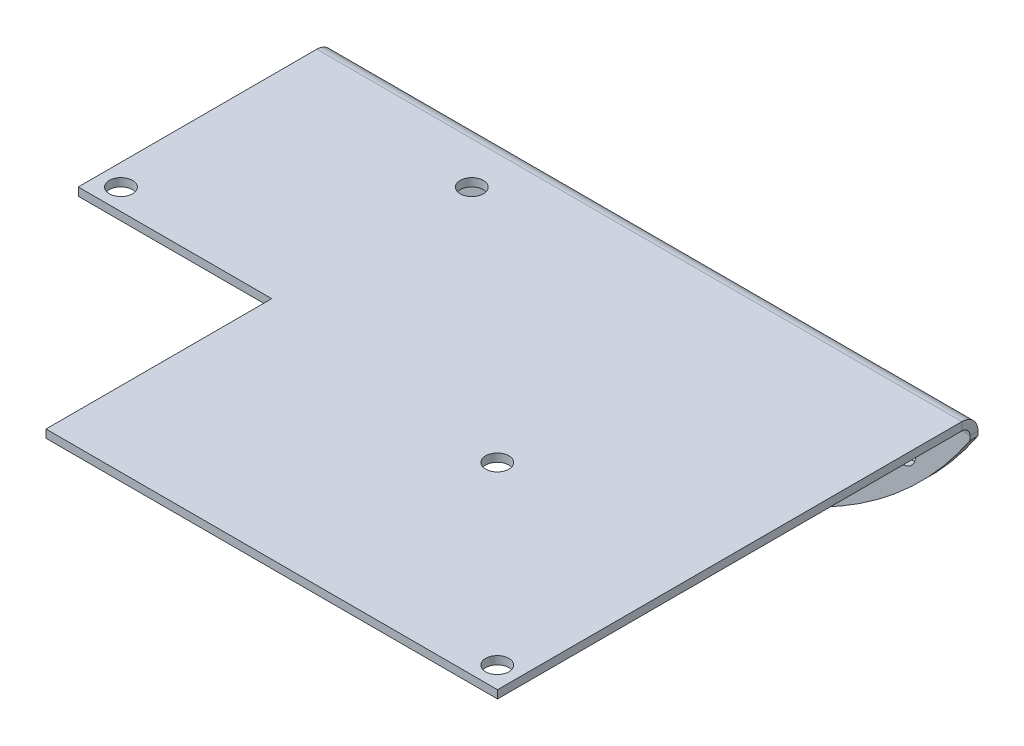
ISO-10303-21;
HEADER;
FILE_DESCRIPTION(('STEP AP214'),'2;1');
FILE_NAME('part.step','',(''),(''),'','','');
FILE_SCHEMA(('AUTOMOTIVE_DESIGN { 1 0 10303 214 1 1 1 1 }'));
ENDSEC;
DATA;
#1=APPLICATION_CONTEXT('core data for automotive mechanical design processes');
#2=APPLICATION_PROTOCOL_DEFINITION('international standard','automotive_design',2000,#1);
#3=PRODUCT_CONTEXT('',#1,'mechanical');
#4=PRODUCT('Part','Part','',(#3));
#5=PRODUCT_RELATED_PRODUCT_CATEGORY('part','',(#4));
#6=PRODUCT_DEFINITION_FORMATION('','',#4);
#7=PRODUCT_DEFINITION_CONTEXT('part definition',#1,'design');
#8=PRODUCT_DEFINITION('design','',#6,#7);
#9=PRODUCT_DEFINITION_SHAPE('','',#8);
#10=(LENGTH_UNIT() NAMED_UNIT(*) SI_UNIT(.MILLI.,.METRE.));
#11=(NAMED_UNIT(*) PLANE_ANGLE_UNIT() SI_UNIT($,.RADIAN.));
#12=(NAMED_UNIT(*) SI_UNIT($,.STERADIAN.) SOLID_ANGLE_UNIT());
#13=UNCERTAINTY_MEASURE_WITH_UNIT(LENGTH_MEASURE(1.E-05),#10,'distance_accuracy_value','');
#14=(GEOMETRIC_REPRESENTATION_CONTEXT(3) GLOBAL_UNCERTAINTY_ASSIGNED_CONTEXT((#13)) GLOBAL_UNIT_ASSIGNED_CONTEXT((#10,
#11,#12)) REPRESENTATION_CONTEXT('',''));
#15=CARTESIAN_POINT('',(0.,0.,0.));
#16=DIRECTION('',(0.,0.,1.));
#17=DIRECTION('',(1.,0.,0.));
#18=AXIS2_PLACEMENT_3D('',#15,#16,#17);
#19=CARTESIAN_POINT('',(0.,-43.9848651624865,41.6620412468196));
#20=DIRECTION('',(0.,-1.,0.));
#21=DIRECTION('',(1.,0.,0.));
#22=AXIS2_PLACEMENT_3D('',#19,#20,#21);
#23=PLANE('',#22);
#24=CARTESIAN_POINT('',(24.7300807192967,-43.9848651624862,56.8325000000002));
#25=DIRECTION('',(0.,1.,0.));
#26=DIRECTION('',(0.,0.,1.));
#27=AXIS2_PLACEMENT_3D('',#24,#25,#26);
#28=CIRCLE('',#27,2.286);
#29=CARTESIAN_POINT('',(24.7300807192967,-43.9848651624862,59.1185000000001));
#30=VERTEX_POINT('',#29);
#31=EDGE_CURVE('E235',#30,#30,#28,.T.);
#32=ORIENTED_EDGE('',*,*,#31,.F.);
#33=EDGE_LOOP('',(#32));
#34=FACE_BOUND('',#33,.T.);
#35=CARTESIAN_POINT('',(59.2740807192967,-43.9848651624861,91.3765000000001));
#36=DIRECTION('',(0.,1.,0.));
#37=DIRECTION('',(0.,0.,1.));
#38=AXIS2_PLACEMENT_3D('',#35,#36,#37);
#39=CIRCLE('',#38,2.28600000000001);
#40=CARTESIAN_POINT('',(59.2740807192967,-43.9848651624861,93.6625000000001));
#41=VERTEX_POINT('',#40);
#42=EDGE_CURVE('E225',#41,#41,#39,.T.);
#43=ORIENTED_EDGE('',*,*,#42,.F.);
#44=EDGE_LOOP('',(#43));
#45=FACE_BOUND('',#44,.T.);
#46=CARTESIAN_POINT('',(-24.7300807192966,-43.9848651624863,12.3825000000001));
#47=DIRECTION('',(0.,1.,0.));
#48=DIRECTION('',(0.,0.,1.));
#49=AXIS2_PLACEMENT_3D('',#46,#47,#48);
#50=CIRCLE('',#49,2.28599999999999);
#51=CARTESIAN_POINT('',(-24.7300807192966,-43.9848651624863,14.6685000000001));
#52=VERTEX_POINT('',#51);
#53=EDGE_CURVE('E222',#52,#52,#50,.T.);
#54=ORIENTED_EDGE('',*,*,#53,.F.);
#55=EDGE_LOOP('',(#54));
#56=FACE_BOUND('',#55,.T.);
#57=CARTESIAN_POINT('',(-59.2740807192966,-43.9848651624862,46.9265000000001));
#58=DIRECTION('',(0.,1.,0.));
#59=DIRECTION('',(0.,0.,1.));
#60=AXIS2_PLACEMENT_3D('',#57,#58,#59);
#61=CIRCLE('',#60,2.28599999999999);
#62=CARTESIAN_POINT('',(-59.2740807192966,-43.9848651624862,49.2125000000001));
#63=VERTEX_POINT('',#62);
#64=EDGE_CURVE('E219',#63,#63,#61,.T.);
#65=ORIENTED_EDGE('',*,*,#64,.F.);
#66=EDGE_LOOP('',(#65));
#67=FACE_BOUND('',#66,.T.);
#68=DIRECTION('',(0.,0.,1.));
#69=VECTOR('',#68,1.);
#70=CARTESIAN_POINT('',(63.5,-43.9848651624865,41.6620412468196));
#71=LINE('',#70,#69);
#72=CARTESIAN_POINT('',(63.5,-43.9848651624864,4.12750000000002));
#73=VERTEX_POINT('',#72);
#74=CARTESIAN_POINT('',(63.5,-43.9848651624867,95.552906409306));
#75=VERTEX_POINT('',#74);
#76=EDGE_CURVE('E57',#73,#75,#71,.T.);
#77=ORIENTED_EDGE('',*,*,#76,.F.);
#78=DIRECTION('',(-1.,0.,0.));
#79=VECTOR('',#78,1.);
#80=CARTESIAN_POINT('',(0.,-43.9848651624864,4.12750000000003));
#81=LINE('',#80,#79);
#82=CARTESIAN_POINT('',(-63.5,-43.9848651624864,4.12750000000002));
#83=VERTEX_POINT('',#82);
#84=EDGE_CURVE('E49',#73,#83,#81,.T.);
#85=ORIENTED_EDGE('',*,*,#84,.T.);
#86=DIRECTION('',(0.,0.,1.));
#87=VECTOR('',#86,1.);
#88=CARTESIAN_POINT('',(-63.5,-43.9848651624865,41.6620412468196));
#89=LINE('',#88,#87);
#90=CARTESIAN_POINT('',(-63.5,-43.9848651624866,51.102906409306));
#91=VERTEX_POINT('',#90);
#92=EDGE_CURVE('E65',#91,#83,#89,.F.);
#93=ORIENTED_EDGE('',*,*,#92,.F.);
#94=DIRECTION('',(1.,0.,0.));
#95=VECTOR('',#94,1.);
#96=CARTESIAN_POINT('',(0.,-43.9848651624866,51.102906409306));
#97=LINE('',#96,#95);
#98=CARTESIAN_POINT('',(-25.4,-43.9848651624866,51.102906409306));
#99=VERTEX_POINT('',#98);
#100=EDGE_CURVE('E189',#99,#91,#97,.F.);
#101=ORIENTED_EDGE('',*,*,#100,.F.);
#102=DIRECTION('',(0.,0.,1.));
#103=VECTOR('',#102,1.);
#104=CARTESIAN_POINT('',(-25.4,-43.9848651624865,41.6620412468196));
#105=LINE('',#104,#103);
#106=CARTESIAN_POINT('',(-25.4,-43.9848651624867,95.552906409306));
#107=VERTEX_POINT('',#106);
#108=EDGE_CURVE('E192',#107,#99,#105,.F.);
#109=ORIENTED_EDGE('',*,*,#108,.F.);
#110=DIRECTION('',(1.,0.,0.));
#111=VECTOR('',#110,1.);
#112=CARTESIAN_POINT('',(0.,-43.9848651624867,95.552906409306));
#113=LINE('',#112,#111);
#114=EDGE_CURVE('E155',#75,#107,#113,.F.);
#115=ORIENTED_EDGE('',*,*,#114,.F.);
#116=EDGE_LOOP('',(#77,#85,#93,#101,#109,#115));
#117=FACE_BOUND('',#116,.T.);
#118=ADVANCED_FACE('F40',(#34,#45,#56,#67,#117),#23,.F.);
#119=CARTESIAN_POINT('',(-25.4,-45.5723651624867,95.552906409306));
#120=DIRECTION('',(-1.,0.,0.));
#121=DIRECTION('',(0.,0.,-1.));
#122=AXIS2_PLACEMENT_3D('',#119,#120,#121);
#123=PLANE('',#122);
#124=DIRECTION('',(0.,-1.,0.));
#125=VECTOR('',#124,1.);
#126=CARTESIAN_POINT('',(-25.4,-45.5723651624867,95.552906409306));
#127=LINE('',#126,#125);
#128=CARTESIAN_POINT('',(-25.4,-45.5723651624867,95.552906409306));
#129=VERTEX_POINT('',#128);
#130=EDGE_CURVE('E202',#107,#129,#127,.T.);
#131=ORIENTED_EDGE('',*,*,#130,.F.);
#132=ORIENTED_EDGE('',*,*,#108,.T.);
#133=DIRECTION('',(0.,-1.,0.));
#134=VECTOR('',#133,1.);
#135=CARTESIAN_POINT('',(-25.4,-45.5723651624866,51.102906409306));
#136=LINE('',#135,#134);
#137=CARTESIAN_POINT('',(-25.4,-45.5723651624866,51.102906409306));
#138=VERTEX_POINT('',#137);
#139=EDGE_CURVE('E199',#99,#138,#136,.T.);
#140=ORIENTED_EDGE('',*,*,#139,.T.);
#141=DIRECTION('',(0.,0.,-1.));
#142=VECTOR('',#141,1.);
#143=CARTESIAN_POINT('',(-25.4,-45.5723651624867,95.552906409306));
#144=LINE('',#143,#142);
#145=EDGE_CURVE('E181',#129,#138,#144,.T.);
#146=ORIENTED_EDGE('',*,*,#145,.F.);
#147=EDGE_LOOP('',(#131,#132,#140,#146));
#148=FACE_BOUND('',#147,.T.);
#149=ADVANCED_FACE('F261',(#148),#123,.T.);
#150=CARTESIAN_POINT('',(-63.5,-45.5723651624866,51.102906409306));
#151=DIRECTION('',(0.,0.,1.));
#152=DIRECTION('',(-1.,0.,0.));
#153=AXIS2_PLACEMENT_3D('',#150,#151,#152);
#154=PLANE('',#153);
#155=ORIENTED_EDGE('',*,*,#139,.F.);
#156=ORIENTED_EDGE('',*,*,#100,.T.);
#157=DIRECTION('',(0.,-1.,0.));
#158=VECTOR('',#157,1.);
#159=CARTESIAN_POINT('',(-63.5,-45.5723651624866,51.102906409306));
#160=LINE('',#159,#158);
#161=CARTESIAN_POINT('',(-63.5,-45.5723651624866,51.102906409306));
#162=VERTEX_POINT('',#161);
#163=EDGE_CURVE('E197',#91,#162,#160,.T.);
#164=ORIENTED_EDGE('',*,*,#163,.T.);
#165=DIRECTION('',(-1.,0.,0.));
#166=VECTOR('',#165,1.);
#167=CARTESIAN_POINT('',(-63.5,-45.5723651624866,51.102906409306));
#168=LINE('',#167,#166);
#169=EDGE_CURVE('E185',#138,#162,#168,.T.);
#170=ORIENTED_EDGE('',*,*,#169,.F.);
#171=EDGE_LOOP('',(#155,#156,#164,#170));
#172=FACE_BOUND('',#171,.T.);
#173=ADVANCED_FACE('F258',(#172),#154,.T.);
#174=CARTESIAN_POINT('',(-63.5,-45.5723651624865,38.402906409306));
#175=DIRECTION('',(-1.,0.,0.));
#176=DIRECTION('',(0.,0.,-1.));
#177=AXIS2_PLACEMENT_3D('',#174,#175,#176);
#178=PLANE('',#177);
#179=DIRECTION('',(0.,1.,0.));
#180=VECTOR('',#179,1.);
#181=CARTESIAN_POINT('',(-63.5,-45.5723651624862,4.12750000000001));
#182=LINE('',#181,#180);
#183=CARTESIAN_POINT('',(-63.5,-45.5723651624864,4.1275));
#184=VERTEX_POINT('',#183);
#185=EDGE_CURVE('E208',#184,#83,#182,.T.);
#186=ORIENTED_EDGE('',*,*,#185,.F.);
#187=DIRECTION('',(0.,0.,-1.));
#188=VECTOR('',#187,1.);
#189=CARTESIAN_POINT('',(-63.5,-45.5723651624865,38.402906409306));
#190=LINE('',#189,#188);
#191=EDGE_CURVE('E188',#162,#184,#190,.T.);
#192=ORIENTED_EDGE('',*,*,#191,.F.);
#193=ORIENTED_EDGE('',*,*,#163,.F.);
#194=ORIENTED_EDGE('',*,*,#92,.T.);
#195=EDGE_LOOP('',(#186,#192,#193,#194));
#196=FACE_BOUND('',#195,.T.);
#197=ADVANCED_FACE('F251',(#196),#178,.T.);
#198=CARTESIAN_POINT('',(63.5,-45.5723651624865,38.402906409306));
#199=DIRECTION('',(1.,0.,0.));
#200=DIRECTION('',(0.,0.,1.));
#201=AXIS2_PLACEMENT_3D('',#198,#199,#200);
#202=PLANE('',#201);
#203=DIRECTION('',(0.,-1.,0.));
#204=VECTOR('',#203,1.);
#205=CARTESIAN_POINT('',(63.5,-45.5723651624862,4.12750000000001));
#206=LINE('',#205,#204);
#207=CARTESIAN_POINT('',(63.5,-45.5723651624864,4.12750000000001));
#208=VERTEX_POINT('',#207);
#209=EDGE_CURVE('E12',#73,#208,#206,.T.);
#210=ORIENTED_EDGE('',*,*,#209,.F.);
#211=ORIENTED_EDGE('',*,*,#76,.T.);
#212=DIRECTION('',(0.,-1.,0.));
#213=VECTOR('',#212,1.);
#214=CARTESIAN_POINT('',(63.5,-45.5723651624867,95.552906409306));
#215=LINE('',#214,#213);
#216=CARTESIAN_POINT('',(63.5,-45.5723651624867,95.552906409306));
#217=VERTEX_POINT('',#216);
#218=EDGE_CURVE('E200',#75,#217,#215,.T.);
#219=ORIENTED_EDGE('',*,*,#218,.T.);
#220=DIRECTION('',(0.,0.,1.));
#221=VECTOR('',#220,1.);
#222=CARTESIAN_POINT('',(63.5,-45.5723651624865,38.402906409306));
#223=LINE('',#222,#221);
#224=EDGE_CURVE('E182',#208,#217,#223,.T.);
#225=ORIENTED_EDGE('',*,*,#224,.F.);
#226=EDGE_LOOP('',(#210,#211,#219,#225));
#227=FACE_BOUND('',#226,.T.);
#228=ADVANCED_FACE('F42',(#227),#202,.T.);
#229=CARTESIAN_POINT('',(-25.4,-45.5723651624867,95.552906409306));
#230=DIRECTION('',(0.,0.,1.));
#231=DIRECTION('',(-1.,0.,0.));
#232=AXIS2_PLACEMENT_3D('',#229,#230,#231);
#233=PLANE('',#232);
#234=ORIENTED_EDGE('',*,*,#114,.T.);
#235=ORIENTED_EDGE('',*,*,#130,.T.);
#236=DIRECTION('',(-1.,0.,0.));
#237=VECTOR('',#236,1.);
#238=CARTESIAN_POINT('',(-25.4,-45.5723651624867,95.552906409306));
#239=LINE('',#238,#237);
#240=EDGE_CURVE('E178',#217,#129,#239,.T.);
#241=ORIENTED_EDGE('',*,*,#240,.F.);
#242=ORIENTED_EDGE('',*,*,#218,.F.);
#243=EDGE_LOOP('',(#234,#235,#241,#242));
#244=FACE_BOUND('',#243,.T.);
#245=ADVANCED_FACE('F264',(#244),#233,.T.);
#246=CARTESIAN_POINT('',(0.,-45.5723651624865,41.6620412468196));
#247=DIRECTION('',(0.,-1.,0.));
#248=DIRECTION('',(1.,0.,0.));
#249=AXIS2_PLACEMENT_3D('',#246,#247,#248);
#250=PLANE('',#249);
#251=CARTESIAN_POINT('',(24.7300807192967,-45.5723651624866,56.8325000000002));
#252=DIRECTION('',(0.,-1.,0.));
#253=DIRECTION('',(0.,0.,-1.));
#254=AXIS2_PLACEMENT_3D('',#251,#252,#253);
#255=CIRCLE('',#254,2.286);
#256=CARTESIAN_POINT('',(24.7300807192967,-45.5723651624866,54.5465000000002));
#257=VERTEX_POINT('',#256);
#258=EDGE_CURVE('E44',#257,#257,#255,.T.);
#259=ORIENTED_EDGE('',*,*,#258,.F.);
#260=EDGE_LOOP('',(#259));
#261=FACE_BOUND('',#260,.T.);
#262=CARTESIAN_POINT('',(59.2740807192967,-45.5723651624867,91.3765000000001));
#263=DIRECTION('',(0.,-1.,0.));
#264=DIRECTION('',(0.,0.,-1.));
#265=AXIS2_PLACEMENT_3D('',#262,#263,#264);
#266=CIRCLE('',#265,2.28600000000001);
#267=CARTESIAN_POINT('',(59.2740807192967,-45.5723651624867,89.0905000000001));
#268=VERTEX_POINT('',#267);
#269=EDGE_CURVE('E223',#268,#268,#266,.T.);
#270=ORIENTED_EDGE('',*,*,#269,.F.);
#271=EDGE_LOOP('',(#270));
#272=FACE_BOUND('',#271,.T.);
#273=CARTESIAN_POINT('',(-24.7300807192966,-45.5723651624864,12.3825000000001));
#274=DIRECTION('',(0.,-1.,0.));
#275=DIRECTION('',(0.,0.,-1.));
#276=AXIS2_PLACEMENT_3D('',#273,#274,#275);
#277=CIRCLE('',#276,2.28599999999999);
#278=CARTESIAN_POINT('',(-24.7300807192966,-45.5723651624864,10.0965000000001));
#279=VERTEX_POINT('',#278);
#280=EDGE_CURVE('E220',#279,#279,#277,.T.);
#281=ORIENTED_EDGE('',*,*,#280,.F.);
#282=EDGE_LOOP('',(#281));
#283=FACE_BOUND('',#282,.T.);
#284=CARTESIAN_POINT('',(-59.2740807192966,-45.5723651624865,46.9265000000001));
#285=DIRECTION('',(0.,-1.,0.));
#286=DIRECTION('',(0.,0.,-1.));
#287=AXIS2_PLACEMENT_3D('',#284,#285,#286);
#288=CIRCLE('',#287,2.28599999999999);
#289=CARTESIAN_POINT('',(-59.2740807192966,-45.5723651624865,44.6405000000001));
#290=VERTEX_POINT('',#289);
#291=EDGE_CURVE('E216',#290,#290,#288,.T.);
#292=ORIENTED_EDGE('',*,*,#291,.F.);
#293=EDGE_LOOP('',(#292));
#294=FACE_BOUND('',#293,.T.);
#295=DIRECTION('',(-1.,0.,0.));
#296=VECTOR('',#295,1.);
#297=CARTESIAN_POINT('',(0.,-45.5723651624864,4.12750000000001));
#298=LINE('',#297,#296);
#299=EDGE_CURVE('E204',#208,#184,#298,.T.);
#300=ORIENTED_EDGE('',*,*,#299,.F.);
#301=ORIENTED_EDGE('',*,*,#224,.T.);
#302=ORIENTED_EDGE('',*,*,#240,.T.);
#303=ORIENTED_EDGE('',*,*,#145,.T.);
#304=ORIENTED_EDGE('',*,*,#169,.T.);
#305=ORIENTED_EDGE('',*,*,#191,.T.);
#306=EDGE_LOOP('',(#300,#301,#302,#303,#304,#305));
#307=FACE_BOUND('',#306,.T.);
#308=ADVANCED_FACE('F253',(#261,#272,#283,#294,#307),#250,.T.);
#309=CARTESIAN_POINT('',(0.,-5.8848651624864,2.54));
#310=DIRECTION('',(0.,0.,1.));
#311=DIRECTION('',(1.,0.,0.));
#312=AXIS2_PLACEMENT_3D('',#309,#310,#311);
#313=CYLINDRICAL_SURFACE('',#312,76.2);
#314=DIRECTION('',(0.,0.,1.));
#315=VECTOR('',#314,1.);
#316=CARTESIAN_POINT('',(-63.5,-48.006,2.54));
#317=LINE('',#316,#315);
#318=CARTESIAN_POINT('',(-63.5,-48.006,0.9525));
#319=VERTEX_POINT('',#318);
#320=CARTESIAN_POINT('',(-63.5,-48.006,2.54));
#321=VERTEX_POINT('',#320);
#322=EDGE_CURVE('E157',#319,#321,#317,.T.);
#323=ORIENTED_EDGE('',*,*,#322,.F.);
#324=CARTESIAN_POINT('',(0.,-5.8848651624864,0.9525));
#325=DIRECTION('',(0.,0.,1.));
#326=DIRECTION('',(1.,0.,0.));
#327=AXIS2_PLACEMENT_3D('',#324,#325,#326);
#328=CIRCLE('',#327,76.2);
#329=CARTESIAN_POINT('',(63.5,-48.006,0.9525));
#330=VERTEX_POINT('',#329);
#331=EDGE_CURVE('E173',#319,#330,#328,.T.);
#332=ORIENTED_EDGE('',*,*,#331,.T.);
#333=DIRECTION('',(0.,0.,1.));
#334=VECTOR('',#333,1.);
#335=CARTESIAN_POINT('',(63.5,-48.006,2.54));
#336=LINE('',#335,#334);
#337=CARTESIAN_POINT('',(63.5,-48.006,2.54));
#338=VERTEX_POINT('',#337);
#339=EDGE_CURVE('E147',#330,#338,#336,.T.);
#340=ORIENTED_EDGE('',*,*,#339,.T.);
#341=CARTESIAN_POINT('',(0.,-5.8848651624864,2.54));
#342=DIRECTION('',(0.,0.,1.));
#343=DIRECTION('',(1.,0.,0.));
#344=AXIS2_PLACEMENT_3D('',#341,#342,#343);
#345=CIRCLE('',#344,76.2);
#346=EDGE_CURVE('E145',#321,#338,#345,.T.);
#347=ORIENTED_EDGE('',*,*,#346,.F.);
#348=EDGE_LOOP('',(#323,#332,#340,#347));
#349=FACE_BOUND('',#348,.T.);
#350=ADVANCED_FACE('F284',(#349),#313,.T.);
#351=CARTESIAN_POINT('',(0.,-5.8848651624864,2.54));
#352=DIRECTION('',(0.,0.,1.));
#353=DIRECTION('',(1.,0.,0.));
#354=AXIS2_PLACEMENT_3D('',#351,#352,#353);
#355=PLANE('',#354);
#356=CARTESIAN_POINT('',(50.2894342779869,-56.1742994404739,2.54));
#357=DIRECTION('',(0.,0.,1.));
#358=DIRECTION('',(1.,0.,0.));
#359=AXIS2_PLACEMENT_3D('',#356,#357,#358);
#360=CIRCLE('',#359,2.48919999999999);
#361=CARTESIAN_POINT('',(52.7786342779869,-56.1742994404739,2.54));
#362=VERTEX_POINT('',#361);
#363=EDGE_CURVE('E344',#362,#362,#360,.T.);
#364=ORIENTED_EDGE('',*,*,#363,.F.);
#365=EDGE_LOOP('',(#364));
#366=FACE_BOUND('',#365,.T.);
#367=CARTESIAN_POINT('',(0.,-77.0048651624864,2.54));
#368=DIRECTION('',(0.,0.,1.));
#369=DIRECTION('',(1.,0.,0.));
#370=AXIS2_PLACEMENT_3D('',#367,#368,#369);
#371=CIRCLE('',#370,2.48919999999999);
#372=CARTESIAN_POINT('',(2.48919999999996,-77.0048651624864,2.54));
#373=VERTEX_POINT('',#372);
#374=EDGE_CURVE('E354',#373,#373,#371,.T.);
#375=ORIENTED_EDGE('',*,*,#374,.F.);
#376=EDGE_LOOP('',(#375));
#377=FACE_BOUND('',#376,.T.);
#378=CARTESIAN_POINT('',(-50.2894342779874,-56.1742994404735,2.54));
#379=DIRECTION('',(0.,0.,1.));
#380=DIRECTION('',(1.,0.,0.));
#381=AXIS2_PLACEMENT_3D('',#378,#379,#380);
#382=CIRCLE('',#381,2.48919999999999);
#383=CARTESIAN_POINT('',(-47.8002342779874,-56.1742994404735,2.54));
#384=VERTEX_POINT('',#383);
#385=EDGE_CURVE('E359',#384,#384,#382,.T.);
#386=ORIENTED_EDGE('',*,*,#385,.F.);
#387=EDGE_LOOP('',(#386));
#388=FACE_BOUND('',#387,.T.);
#389=DIRECTION('',(0.,1.,0.));
#390=VECTOR('',#389,1.);
#391=CARTESIAN_POINT('',(63.5,-9.14400000000001,2.54));
#392=LINE('',#391,#390);
#393=CARTESIAN_POINT('',(63.5,-47.1598651624864,2.54));
#394=VERTEX_POINT('',#393);
#395=EDGE_CURVE('E139',#338,#394,#392,.T.);
#396=ORIENTED_EDGE('',*,*,#395,.T.);
#397=DIRECTION('',(-1.,0.,0.));
#398=VECTOR('',#397,1.);
#399=CARTESIAN_POINT('',(0.,-47.1598651624864,2.54));
#400=LINE('',#399,#398);
#401=CARTESIAN_POINT('',(-63.5,-47.1598651624864,2.54));
#402=VERTEX_POINT('',#401);
#403=EDGE_CURVE('E132',#394,#402,#400,.T.);
#404=ORIENTED_EDGE('',*,*,#403,.T.);
#405=DIRECTION('',(0.,-1.,0.));
#406=VECTOR('',#405,1.);
#407=CARTESIAN_POINT('',(-63.5,-9.14400000000001,2.54));
#408=LINE('',#407,#406);
#409=EDGE_CURVE('E138',#402,#321,#408,.T.);
#410=ORIENTED_EDGE('',*,*,#409,.T.);
#411=ORIENTED_EDGE('',*,*,#346,.T.);
#412=EDGE_LOOP('',(#396,#404,#410,#411));
#413=FACE_BOUND('',#412,.T.);
#414=ADVANCED_FACE('F143',(#366,#377,#388,#413),#355,.T.);
#415=CARTESIAN_POINT('',(-63.5,-9.14400000000001,2.54));
#416=DIRECTION('',(-1.,0.,0.));
#417=DIRECTION('',(0.,-1.,0.));
#418=AXIS2_PLACEMENT_3D('',#415,#416,#417);
#419=PLANE('',#418);
#420=ORIENTED_EDGE('',*,*,#409,.F.);
#421=DIRECTION('',(0.,0.,-1.));
#422=VECTOR('',#421,1.);
#423=CARTESIAN_POINT('',(-63.5,-47.1598651624864,2.53999999999973));
#424=LINE('',#423,#422);
#425=CARTESIAN_POINT('',(-63.5,-47.1598651624864,0.9525));
#426=VERTEX_POINT('',#425);
#427=EDGE_CURVE('E167',#402,#426,#424,.T.);
#428=ORIENTED_EDGE('',*,*,#427,.T.);
#429=DIRECTION('',(0.,1.,0.));
#430=VECTOR('',#429,1.);
#431=CARTESIAN_POINT('',(-63.5,-5.8848651624864,0.9525));
#432=LINE('',#431,#430);
#433=EDGE_CURVE('E165',#426,#319,#432,.F.);
#434=ORIENTED_EDGE('',*,*,#433,.T.);
#435=ORIENTED_EDGE('',*,*,#322,.T.);
#436=EDGE_LOOP('',(#420,#428,#434,#435));
#437=FACE_BOUND('',#436,.T.);
#438=ADVANCED_FACE('F294',(#437),#419,.T.);
#439=CARTESIAN_POINT('',(0.,-5.8848651624864,0.9525));
#440=DIRECTION('',(0.,0.,1.));
#441=DIRECTION('',(1.,0.,0.));
#442=AXIS2_PLACEMENT_3D('',#439,#440,#441);
#443=PLANE('',#442);
#444=CARTESIAN_POINT('',(50.2894342779869,-56.1742994404739,0.952499999999999));
#445=DIRECTION('',(0.,0.,-1.));
#446=DIRECTION('',(-1.,0.,0.));
#447=AXIS2_PLACEMENT_3D('',#444,#445,#446);
#448=CIRCLE('',#447,2.48919999999999);
#449=CARTESIAN_POINT('',(47.800234277987,-56.1742994404739,0.952499999999999));
#450=VERTEX_POINT('',#449);
#451=EDGE_CURVE('E347',#450,#450,#448,.T.);
#452=ORIENTED_EDGE('',*,*,#451,.F.);
#453=EDGE_LOOP('',(#452));
#454=FACE_BOUND('',#453,.T.);
#455=CARTESIAN_POINT('',(0.,-77.0048651624864,0.952499999999999));
#456=DIRECTION('',(0.,0.,-1.));
#457=DIRECTION('',(-1.,0.,0.));
#458=AXIS2_PLACEMENT_3D('',#455,#456,#457);
#459=CIRCLE('',#458,2.48919999999999);
#460=CARTESIAN_POINT('',(-2.48920000000001,-77.0048651624864,0.952499999999999));
#461=VERTEX_POINT('',#460);
#462=EDGE_CURVE('E349',#461,#461,#459,.T.);
#463=ORIENTED_EDGE('',*,*,#462,.F.);
#464=EDGE_LOOP('',(#463));
#465=FACE_BOUND('',#464,.T.);
#466=CARTESIAN_POINT('',(-50.2894342779874,-56.1742994404735,0.952499999999999));
#467=DIRECTION('',(0.,0.,-1.));
#468=DIRECTION('',(-1.,0.,0.));
#469=AXIS2_PLACEMENT_3D('',#466,#467,#468);
#470=CIRCLE('',#469,2.48919999999999);
#471=CARTESIAN_POINT('',(-52.7786342779874,-56.1742994404735,0.952499999999999));
#472=VERTEX_POINT('',#471);
#473=EDGE_CURVE('E357',#472,#472,#470,.T.);
#474=ORIENTED_EDGE('',*,*,#473,.F.);
#475=EDGE_LOOP('',(#474));
#476=FACE_BOUND('',#475,.T.);
#477=DIRECTION('',(-1.,0.,0.));
#478=VECTOR('',#477,1.);
#479=CARTESIAN_POINT('',(0.,-47.1598651624864,0.9525));
#480=LINE('',#479,#478);
#481=CARTESIAN_POINT('',(63.5,-47.1598651624864,0.9525));
#482=VERTEX_POINT('',#481);
#483=EDGE_CURVE('E176',#482,#426,#480,.T.);
#484=ORIENTED_EDGE('',*,*,#483,.F.);
#485=DIRECTION('',(0.,1.,0.));
#486=VECTOR('',#485,1.);
#487=CARTESIAN_POINT('',(63.5,-5.8848651624864,0.9525));
#488=LINE('',#487,#486);
#489=EDGE_CURVE('E152',#330,#482,#488,.T.);
#490=ORIENTED_EDGE('',*,*,#489,.F.);
#491=ORIENTED_EDGE('',*,*,#331,.F.);
#492=ORIENTED_EDGE('',*,*,#433,.F.);
#493=EDGE_LOOP('',(#484,#490,#491,#492));
#494=FACE_BOUND('',#493,.T.);
#495=ADVANCED_FACE('F291',(#454,#465,#476,#494),#443,.F.);
#496=CARTESIAN_POINT('',(63.5,-9.14400000000001,2.54));
#497=DIRECTION('',(1.,0.,0.));
#498=DIRECTION('',(0.,1.,0.));
#499=AXIS2_PLACEMENT_3D('',#496,#497,#498);
#500=PLANE('',#499);
#501=ORIENTED_EDGE('',*,*,#489,.T.);
#502=DIRECTION('',(0.,0.,1.));
#503=VECTOR('',#502,1.);
#504=CARTESIAN_POINT('',(63.5,-47.1598651624864,2.53999999999973));
#505=LINE('',#504,#503);
#506=EDGE_CURVE('E123',#482,#394,#505,.T.);
#507=ORIENTED_EDGE('',*,*,#506,.T.);
#508=ORIENTED_EDGE('',*,*,#395,.F.);
#509=ORIENTED_EDGE('',*,*,#339,.F.);
#510=EDGE_LOOP('',(#501,#507,#508,#509));
#511=FACE_BOUND('',#510,.T.);
#512=ADVANCED_FACE('F150',(#511),#500,.T.);
#513=CARTESIAN_POINT('',(63.5,-47.1598651624864,4.1275));
#514=DIRECTION('',(-1.,0.,0.));
#515=DIRECTION('',(0.,0.,1.));
#516=AXIS2_PLACEMENT_3D('',#513,#514,#515);
#517=PLANE('',#516);
#518=ORIENTED_EDGE('',*,*,#506,.F.);
#519=CARTESIAN_POINT('',(63.5,-47.1598651624864,4.1275));
#520=DIRECTION('',(-1.,0.,0.));
#521=DIRECTION('',(0.,0.,1.));
#522=AXIS2_PLACEMENT_3D('',#519,#520,#521);
#523=CIRCLE('',#522,3.175);
#524=EDGE_CURVE('E160',#482,#73,#523,.F.);
#525=ORIENTED_EDGE('',*,*,#524,.T.);
#526=ORIENTED_EDGE('',*,*,#209,.T.);
#527=CARTESIAN_POINT('',(63.5,-47.1598651624864,4.1275));
#528=DIRECTION('',(1.,0.,0.));
#529=DIRECTION('',(0.,0.,-1.));
#530=AXIS2_PLACEMENT_3D('',#527,#528,#529);
#531=CIRCLE('',#530,1.5875);
#532=EDGE_CURVE('E118',#394,#208,#531,.T.);
#533=ORIENTED_EDGE('',*,*,#532,.F.);
#534=EDGE_LOOP('',(#518,#525,#526,#533));
#535=FACE_BOUND('',#534,.T.);
#536=ADVANCED_FACE('F120',(#535),#517,.F.);
#537=CARTESIAN_POINT('',(-63.5,-47.1598651624864,4.1275));
#538=DIRECTION('',(1.,0.,0.));
#539=DIRECTION('',(0.,0.,-1.));
#540=AXIS2_PLACEMENT_3D('',#537,#538,#539);
#541=PLANE('',#540);
#542=ORIENTED_EDGE('',*,*,#185,.T.);
#543=CARTESIAN_POINT('',(-63.5,-47.1598651624864,4.1275));
#544=DIRECTION('',(-1.,0.,0.));
#545=DIRECTION('',(0.,0.,1.));
#546=AXIS2_PLACEMENT_3D('',#543,#544,#545);
#547=CIRCLE('',#546,3.175);
#548=EDGE_CURVE('E128',#83,#426,#547,.T.);
#549=ORIENTED_EDGE('',*,*,#548,.T.);
#550=ORIENTED_EDGE('',*,*,#427,.F.);
#551=CARTESIAN_POINT('',(-63.5,-47.1598651624864,4.1275));
#552=DIRECTION('',(-1.,0.,0.));
#553=DIRECTION('',(0.,0.,1.));
#554=AXIS2_PLACEMENT_3D('',#551,#552,#553);
#555=CIRCLE('',#554,1.5875);
#556=EDGE_CURVE('E127',#184,#402,#555,.T.);
#557=ORIENTED_EDGE('',*,*,#556,.F.);
#558=EDGE_LOOP('',(#542,#549,#550,#557));
#559=FACE_BOUND('',#558,.T.);
#560=ADVANCED_FACE('F249',(#559),#541,.F.);
#561=CARTESIAN_POINT('',(127.064988049164,-47.1598651624864,4.1275));
#562=DIRECTION('',(-1.,0.,0.));
#563=DIRECTION('',(0.,0.,1.));
#564=AXIS2_PLACEMENT_3D('',#561,#562,#563);
#565=CYLINDRICAL_SURFACE('',#564,1.5875);
#566=ORIENTED_EDGE('',*,*,#556,.T.);
#567=ORIENTED_EDGE('',*,*,#403,.F.);
#568=ORIENTED_EDGE('',*,*,#532,.T.);
#569=ORIENTED_EDGE('',*,*,#299,.T.);
#570=EDGE_LOOP('',(#566,#567,#568,#569));
#571=FACE_BOUND('',#570,.T.);
#572=ADVANCED_FACE('F134',(#571),#565,.F.);
#573=CARTESIAN_POINT('',(127.064988049164,-47.1598651624864,4.1275));
#574=DIRECTION('',(-1.,0.,0.));
#575=DIRECTION('',(0.,0.,1.));
#576=AXIS2_PLACEMENT_3D('',#573,#574,#575);
#577=CYLINDRICAL_SURFACE('',#576,3.175);
#578=ORIENTED_EDGE('',*,*,#548,.F.);
#579=ORIENTED_EDGE('',*,*,#84,.F.);
#580=ORIENTED_EDGE('',*,*,#524,.F.);
#581=ORIENTED_EDGE('',*,*,#483,.T.);
#582=EDGE_LOOP('',(#578,#579,#580,#581));
#583=FACE_BOUND('',#582,.T.);
#584=ADVANCED_FACE('F247',(#583),#577,.T.);
#585=CARTESIAN_POINT('',(-59.2740807192966,-82.0848651624866,46.9265000000002));
#586=DIRECTION('',(0.,1.,0.));
#587=DIRECTION('',(0.,0.,1.));
#588=AXIS2_PLACEMENT_3D('',#585,#586,#587);
#589=CYLINDRICAL_SURFACE('',#588,2.28599999999999);
#590=ORIENTED_EDGE('',*,*,#291,.T.);
#591=EDGE_LOOP('',(#590));
#592=FACE_BOUND('',#591,.T.);
#593=ORIENTED_EDGE('',*,*,#64,.T.);
#594=EDGE_LOOP('',(#593));
#595=FACE_BOUND('',#594,.T.);
#596=ADVANCED_FACE('F311',(#592,#595),#589,.F.);
#597=CARTESIAN_POINT('',(-24.7300807192966,-82.0848651624867,12.3825000000002));
#598=DIRECTION('',(0.,1.,0.));
#599=DIRECTION('',(0.,0.,1.));
#600=AXIS2_PLACEMENT_3D('',#597,#598,#599);
#601=CYLINDRICAL_SURFACE('',#600,2.28599999999999);
#602=ORIENTED_EDGE('',*,*,#280,.T.);
#603=EDGE_LOOP('',(#602));
#604=FACE_BOUND('',#603,.T.);
#605=ORIENTED_EDGE('',*,*,#53,.T.);
#606=EDGE_LOOP('',(#605));
#607=FACE_BOUND('',#606,.T.);
#608=ADVANCED_FACE('F316',(#604,#607),#601,.F.);
#609=CARTESIAN_POINT('',(59.2740807192967,-82.0848651624864,91.3765000000002));
#610=DIRECTION('',(0.,1.,0.));
#611=DIRECTION('',(0.,0.,1.));
#612=AXIS2_PLACEMENT_3D('',#609,#610,#611);
#613=CYLINDRICAL_SURFACE('',#612,2.28600000000001);
#614=ORIENTED_EDGE('',*,*,#269,.T.);
#615=EDGE_LOOP('',(#614));
#616=FACE_BOUND('',#615,.T.);
#617=ORIENTED_EDGE('',*,*,#42,.T.);
#618=EDGE_LOOP('',(#617));
#619=FACE_BOUND('',#618,.T.);
#620=ADVANCED_FACE('F320',(#616,#619),#613,.F.);
#621=CARTESIAN_POINT('',(24.7300807192967,-82.0848651624865,56.8325000000003));
#622=DIRECTION('',(0.,1.,0.));
#623=DIRECTION('',(0.,0.,1.));
#624=AXIS2_PLACEMENT_3D('',#621,#622,#623);
#625=CYLINDRICAL_SURFACE('',#624,2.286);
#626=ORIENTED_EDGE('',*,*,#258,.T.);
#627=EDGE_LOOP('',(#626));
#628=FACE_BOUND('',#627,.T.);
#629=ORIENTED_EDGE('',*,*,#31,.T.);
#630=EDGE_LOOP('',(#629));
#631=FACE_BOUND('',#630,.T.);
#632=ADVANCED_FACE('F324',(#628,#631),#625,.F.);
#633=CARTESIAN_POINT('',(-50.2894342779874,-56.1742994404735,0.9525));
#634=DIRECTION('',(0.,0.,-1.));
#635=DIRECTION('',(-1.,0.,0.));
#636=AXIS2_PLACEMENT_3D('',#633,#634,#635);
#637=CYLINDRICAL_SURFACE('',#636,2.48919999999999);
#638=ORIENTED_EDGE('',*,*,#385,.T.);
#639=EDGE_LOOP('',(#638));
#640=FACE_BOUND('',#639,.T.);
#641=ORIENTED_EDGE('',*,*,#473,.T.);
#642=EDGE_LOOP('',(#641));
#643=FACE_BOUND('',#642,.T.);
#644=ADVANCED_FACE('F327',(#640,#643),#637,.F.);
#645=CARTESIAN_POINT('',(0.,-77.0048651624864,0.9525));
#646=DIRECTION('',(0.,0.,-1.));
#647=DIRECTION('',(-1.,0.,0.));
#648=AXIS2_PLACEMENT_3D('',#645,#646,#647);
#649=CYLINDRICAL_SURFACE('',#648,2.48919999999999);
#650=ORIENTED_EDGE('',*,*,#374,.T.);
#651=EDGE_LOOP('',(#650));
#652=FACE_BOUND('',#651,.T.);
#653=ORIENTED_EDGE('',*,*,#462,.T.);
#654=EDGE_LOOP('',(#653));
#655=FACE_BOUND('',#654,.T.);
#656=ADVANCED_FACE('F331',(#652,#655),#649,.F.);
#657=CARTESIAN_POINT('',(50.2894342779869,-56.1742994404739,0.9525));
#658=DIRECTION('',(0.,0.,-1.));
#659=DIRECTION('',(-1.,0.,0.));
#660=AXIS2_PLACEMENT_3D('',#657,#658,#659);
#661=CYLINDRICAL_SURFACE('',#660,2.48919999999999);
#662=ORIENTED_EDGE('',*,*,#363,.T.);
#663=EDGE_LOOP('',(#662));
#664=FACE_BOUND('',#663,.T.);
#665=ORIENTED_EDGE('',*,*,#451,.T.);
#666=EDGE_LOOP('',(#665));
#667=FACE_BOUND('',#666,.T.);
#668=ADVANCED_FACE('F335',(#664,#667),#661,.F.);
#669=CLOSED_SHELL('',(#118,#149,#173,#197,#228,#245,#308,#350,#414,#438,#495,#512,#536,#560,
#572,#584,#596,#608,#620,#632,#644,#656,#668));
#670=MANIFOLD_SOLID_BREP('B2',#669);
#671=ADVANCED_BREP_SHAPE_REPRESENTATION('',(#18,#670),#14);
#672=SHAPE_DEFINITION_REPRESENTATION(#9,#671);
ENDSEC;
END-ISO-10303-21;
